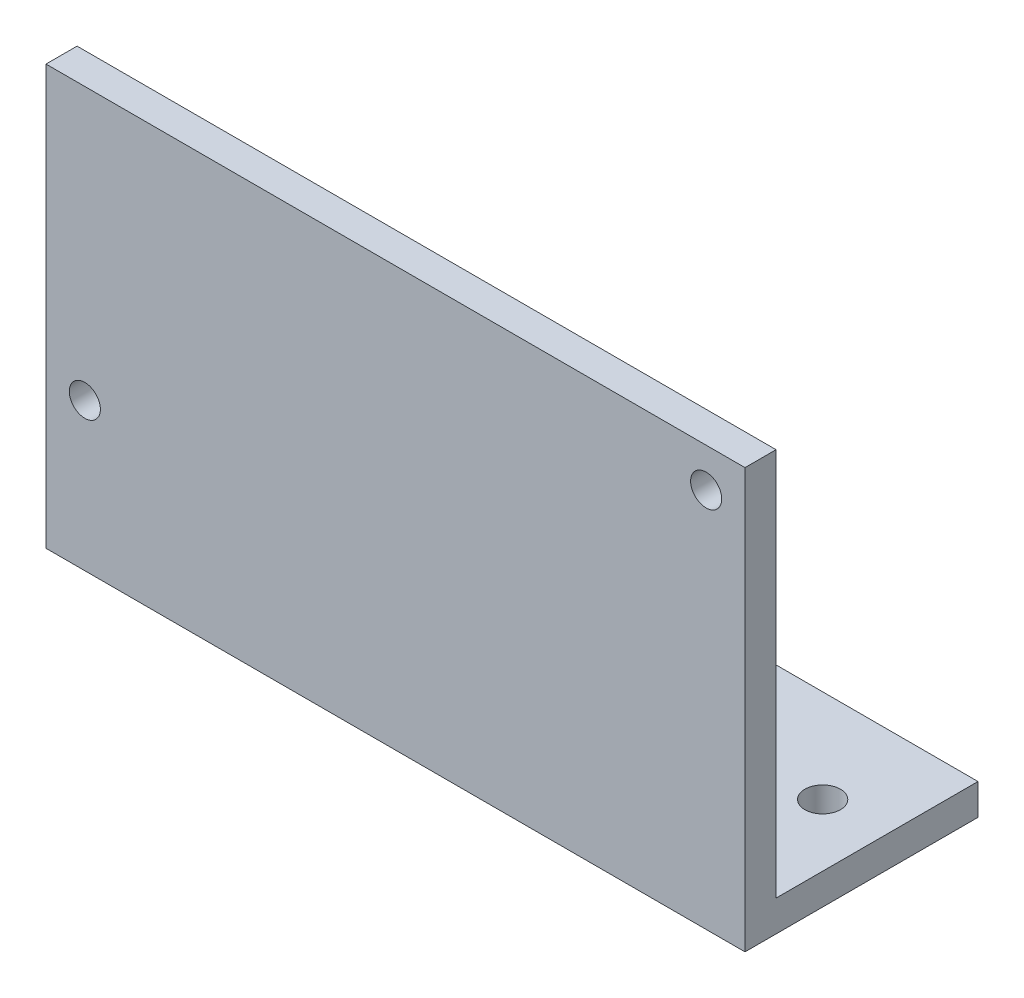
ISO-10303-21;
HEADER;
FILE_DESCRIPTION(('STEP AP214'),'2;1');
FILE_NAME('part.step','',(''),(''),'','','');
FILE_SCHEMA(('AUTOMOTIVE_DESIGN { 1 0 10303 214 1 1 1 1 }'));
ENDSEC;
DATA;
#1=APPLICATION_CONTEXT('core data for automotive mechanical design processes');
#2=APPLICATION_PROTOCOL_DEFINITION('international standard','automotive_design',2000,#1);
#3=PRODUCT_CONTEXT('',#1,'mechanical');
#4=PRODUCT('Part','Part','',(#3));
#5=PRODUCT_RELATED_PRODUCT_CATEGORY('part','',(#4));
#6=PRODUCT_DEFINITION_FORMATION('','',#4);
#7=PRODUCT_DEFINITION_CONTEXT('part definition',#1,'design');
#8=PRODUCT_DEFINITION('design','',#6,#7);
#9=PRODUCT_DEFINITION_SHAPE('','',#8);
#10=(LENGTH_UNIT() NAMED_UNIT(*) SI_UNIT(.MILLI.,.METRE.));
#11=(NAMED_UNIT(*) PLANE_ANGLE_UNIT() SI_UNIT($,.RADIAN.));
#12=(NAMED_UNIT(*) SI_UNIT($,.STERADIAN.) SOLID_ANGLE_UNIT());
#13=UNCERTAINTY_MEASURE_WITH_UNIT(LENGTH_MEASURE(1.E-05),#10,'distance_accuracy_value','');
#14=(GEOMETRIC_REPRESENTATION_CONTEXT(3) GLOBAL_UNCERTAINTY_ASSIGNED_CONTEXT((#13)) GLOBAL_UNIT_ASSIGNED_CONTEXT((#10,
#11,#12)) REPRESENTATION_CONTEXT('',''));
#15=CARTESIAN_POINT('',(0.,0.,0.));
#16=DIRECTION('',(0.,0.,1.));
#17=DIRECTION('',(1.,0.,0.));
#18=AXIS2_PLACEMENT_3D('',#15,#16,#17);
#19=CARTESIAN_POINT('',(16.8724801217886,-1.26370636243738,1.14413041174016));
#20=DIRECTION('',(1.,0.,0.));
#21=DIRECTION('',(0.,0.,-1.));
#22=AXIS2_PLACEMENT_3D('',#19,#20,#21);
#23=PLANE('',#22);
#24=DIRECTION('',(0.,-1.,0.));
#25=VECTOR('',#24,1.);
#26=CARTESIAN_POINT('',(16.8724801217886,-1.26370636243738,1.14413041174016));
#27=LINE('',#26,#25);
#28=CARTESIAN_POINT('',(16.8724801217886,8.11129363756262,1.14413041174016));
#29=VERTEX_POINT('',#28);
#30=CARTESIAN_POINT('',(16.8724801217886,-12.1387063624374,1.14413041174016));
#31=VERTEX_POINT('',#30);
#32=EDGE_CURVE('E55',#29,#31,#27,.T.);
#33=ORIENTED_EDGE('',*,*,#32,.T.);
#34=DIRECTION('',(0.,0.,-1.));
#35=VECTOR('',#34,1.);
#36=CARTESIAN_POINT('',(16.8724801217886,-12.1387063624374,1.14413041174016));
#37=LINE('',#36,#35);
#38=CARTESIAN_POINT('',(16.8724801217886,-12.1387063624374,-10.1058695882598));
#39=VERTEX_POINT('',#38);
#40=EDGE_CURVE('E110',#31,#39,#37,.T.);
#41=ORIENTED_EDGE('',*,*,#40,.T.);
#42=DIRECTION('',(0.,1.,0.));
#43=VECTOR('',#42,1.);
#44=CARTESIAN_POINT('',(16.8724801217886,-12.1387063624374,-10.1058695882598));
#45=LINE('',#44,#43);
#46=CARTESIAN_POINT('',(16.8724801217886,-10.6387063624374,-10.1058695882598));
#47=VERTEX_POINT('',#46);
#48=EDGE_CURVE('E136',#39,#47,#45,.T.);
#49=ORIENTED_EDGE('',*,*,#48,.T.);
#50=DIRECTION('',(0.,0.,1.));
#51=VECTOR('',#50,1.);
#52=CARTESIAN_POINT('',(16.8724801217886,-10.6387063624374,-10.1058695882598));
#53=LINE('',#52,#51);
#54=CARTESIAN_POINT('',(16.8724801217886,-10.6387063624374,-0.355869588259836));
#55=VERTEX_POINT('',#54);
#56=EDGE_CURVE('E114',#47,#55,#53,.T.);
#57=ORIENTED_EDGE('',*,*,#56,.T.);
#58=DIRECTION('',(0.,-1.,0.));
#59=VECTOR('',#58,1.);
#60=CARTESIAN_POINT('',(16.8724801217886,-1.26370636243738,-0.355869588259836));
#61=LINE('',#60,#59);
#62=CARTESIAN_POINT('',(16.8724801217886,8.11129363756262,-0.355869588259836));
#63=VERTEX_POINT('',#62);
#64=EDGE_CURVE('E111',#63,#55,#61,.T.);
#65=ORIENTED_EDGE('',*,*,#64,.F.);
#66=DIRECTION('',(0.,0.,-1.));
#67=VECTOR('',#66,1.);
#68=CARTESIAN_POINT('',(16.8724801217886,8.11129363756262,1.14413041174016));
#69=LINE('',#68,#67);
#70=EDGE_CURVE('E47',#29,#63,#69,.T.);
#71=ORIENTED_EDGE('',*,*,#70,.F.);
#72=EDGE_LOOP('',(#33,#41,#49,#57,#65,#71));
#73=FACE_BOUND('',#72,.T.);
#74=ADVANCED_FACE('F39',(#73),#23,.T.);
#75=CARTESIAN_POINT('',(-0.00251987821140183,8.11129363756262,1.14413041174016));
#76=DIRECTION('',(0.,1.,0.));
#77=DIRECTION('',(-1.,0.,0.));
#78=AXIS2_PLACEMENT_3D('',#75,#76,#77);
#79=PLANE('',#78);
#80=DIRECTION('',(1.,0.,0.));
#81=VECTOR('',#80,1.);
#82=CARTESIAN_POINT('',(-0.00251987821140183,8.11129363756262,-0.355869588259836));
#83=LINE('',#82,#81);
#84=CARTESIAN_POINT('',(-16.8775198782114,8.11129363756261,-0.355869588259836));
#85=VERTEX_POINT('',#84);
#86=EDGE_CURVE('E88',#85,#63,#83,.T.);
#87=ORIENTED_EDGE('',*,*,#86,.F.);
#88=DIRECTION('',(0.,0.,-1.));
#89=VECTOR('',#88,1.);
#90=CARTESIAN_POINT('',(-16.8775198782114,8.11129363756261,1.14413041174016));
#91=LINE('',#90,#89);
#92=CARTESIAN_POINT('',(-16.8775198782114,8.11129363756261,1.14413041174016));
#93=VERTEX_POINT('',#92);
#94=EDGE_CURVE('E82',#93,#85,#91,.T.);
#95=ORIENTED_EDGE('',*,*,#94,.F.);
#96=DIRECTION('',(1.,0.,0.));
#97=VECTOR('',#96,1.);
#98=CARTESIAN_POINT('',(-0.00251987821140183,8.11129363756262,1.14413041174016));
#99=LINE('',#98,#97);
#100=EDGE_CURVE('E86',#93,#29,#99,.T.);
#101=ORIENTED_EDGE('',*,*,#100,.T.);
#102=ORIENTED_EDGE('',*,*,#70,.T.);
#103=EDGE_LOOP('',(#87,#95,#101,#102));
#104=FACE_BOUND('',#103,.T.);
#105=ADVANCED_FACE('F84',(#104),#79,.T.);
#106=CARTESIAN_POINT('',(-16.8775198782114,-1.26370636243738,1.14413041174016));
#107=DIRECTION('',(1.,0.,0.));
#108=DIRECTION('',(0.,1.,0.));
#109=AXIS2_PLACEMENT_3D('',#106,#107,#108);
#110=PLANE('',#109);
#111=DIRECTION('',(0.,-1.,0.));
#112=VECTOR('',#111,1.);
#113=CARTESIAN_POINT('',(-16.8775198782114,-1.26370636243738,-0.355869588259836));
#114=LINE('',#113,#112);
#115=CARTESIAN_POINT('',(-16.8775198782114,-10.6387063624374,-0.355869588259836));
#116=VERTEX_POINT('',#115);
#117=EDGE_CURVE('E105',#85,#116,#114,.T.);
#118=ORIENTED_EDGE('',*,*,#117,.T.);
#119=DIRECTION('',(0.,0.,1.));
#120=VECTOR('',#119,1.);
#121=CARTESIAN_POINT('',(-16.8775198782114,-10.6387063624374,-10.1058695882598));
#122=LINE('',#121,#120);
#123=CARTESIAN_POINT('',(-16.8775198782114,-10.6387063624374,-10.1058695882598));
#124=VERTEX_POINT('',#123);
#125=EDGE_CURVE('E139',#124,#116,#122,.T.);
#126=ORIENTED_EDGE('',*,*,#125,.F.);
#127=DIRECTION('',(0.,-1.,0.));
#128=VECTOR('',#127,1.);
#129=CARTESIAN_POINT('',(-16.8775198782114,-10.6387063624374,-10.1058695882598));
#130=LINE('',#129,#128);
#131=CARTESIAN_POINT('',(-16.8775198782114,-12.1387063624374,-10.1058695882598));
#132=VERTEX_POINT('',#131);
#133=EDGE_CURVE('E133',#124,#132,#130,.T.);
#134=ORIENTED_EDGE('',*,*,#133,.T.);
#135=DIRECTION('',(0.,0.,-1.));
#136=VECTOR('',#135,1.);
#137=CARTESIAN_POINT('',(-16.8775198782114,-12.1387063624374,1.14413041174016));
#138=LINE('',#137,#136);
#139=CARTESIAN_POINT('',(-16.8775198782114,-12.1387063624374,1.14413041174016));
#140=VERTEX_POINT('',#139);
#141=EDGE_CURVE('E92',#140,#132,#138,.T.);
#142=ORIENTED_EDGE('',*,*,#141,.F.);
#143=DIRECTION('',(0.,-1.,0.));
#144=VECTOR('',#143,1.);
#145=CARTESIAN_POINT('',(-16.8775198782114,-1.26370636243738,1.14413041174016));
#146=LINE('',#145,#144);
#147=EDGE_CURVE('E95',#93,#140,#146,.T.);
#148=ORIENTED_EDGE('',*,*,#147,.F.);
#149=ORIENTED_EDGE('',*,*,#94,.T.);
#150=EDGE_LOOP('',(#118,#126,#134,#142,#148,#149));
#151=FACE_BOUND('',#150,.T.);
#152=ADVANCED_FACE('F96',(#151),#110,.F.);
#153=CARTESIAN_POINT('',(-0.00251987821139894,-12.1387063624374,1.14413041174016));
#154=DIRECTION('',(0.,1.,0.));
#155=DIRECTION('',(0.,0.,1.));
#156=AXIS2_PLACEMENT_3D('',#153,#154,#155);
#157=PLANE('',#156);
#158=CARTESIAN_POINT('',(-13.8775198782114,-12.1387063624374,-5.60586958825983));
#159=DIRECTION('',(0.,1.,0.));
#160=DIRECTION('',(0.,0.,1.));
#161=AXIS2_PLACEMENT_3D('',#158,#159,#160);
#162=CIRCLE('',#161,0.750000000000001);
#163=CARTESIAN_POINT('',(-13.8775198782114,-12.1387063624374,-4.85586958825983));
#164=VERTEX_POINT('',#163);
#165=EDGE_CURVE('E198',#164,#164,#162,.T.);
#166=ORIENTED_EDGE('',*,*,#165,.T.);
#167=EDGE_LOOP('',(#166));
#168=FACE_BOUND('',#167,.T.);
#169=CARTESIAN_POINT('',(13.8724801217886,-12.1387063624374,-5.60586958825983));
#170=DIRECTION('',(0.,1.,0.));
#171=DIRECTION('',(0.,0.,1.));
#172=AXIS2_PLACEMENT_3D('',#169,#170,#171);
#173=CIRCLE('',#172,0.858355693551781);
#174=CARTESIAN_POINT('',(13.8724801217886,-12.1387063624374,-4.74751389470805));
#175=VERTEX_POINT('',#174);
#176=EDGE_CURVE('E200',#175,#175,#173,.T.);
#177=ORIENTED_EDGE('',*,*,#176,.T.);
#178=EDGE_LOOP('',(#177));
#179=FACE_BOUND('',#178,.T.);
#180=ORIENTED_EDGE('',*,*,#141,.T.);
#181=DIRECTION('',(1.,0.,0.));
#182=VECTOR('',#181,1.);
#183=CARTESIAN_POINT('',(-16.8775198782114,-12.1387063624374,-10.1058695882598));
#184=LINE('',#183,#182);
#185=EDGE_CURVE('E125',#132,#39,#184,.T.);
#186=ORIENTED_EDGE('',*,*,#185,.T.);
#187=ORIENTED_EDGE('',*,*,#40,.F.);
#188=DIRECTION('',(1.,0.,0.));
#189=VECTOR('',#188,1.);
#190=CARTESIAN_POINT('',(-0.00251987821139894,-12.1387063624374,1.14413041174016));
#191=LINE('',#190,#189);
#192=EDGE_CURVE('E101',#140,#31,#191,.T.);
#193=ORIENTED_EDGE('',*,*,#192,.F.);
#194=EDGE_LOOP('',(#180,#186,#187,#193));
#195=FACE_BOUND('',#194,.T.);
#196=ADVANCED_FACE('F122',(#168,#179,#195),#157,.F.);
#197=CARTESIAN_POINT('',(-0.00251987821139894,-1.26370636243738,1.14413041174016));
#198=DIRECTION('',(0.,0.,1.));
#199=DIRECTION('',(1.,0.,0.));
#200=AXIS2_PLACEMENT_3D('',#197,#198,#199);
#201=PLANE('',#200);
#202=CARTESIAN_POINT('',(14.9974801217886,6.23629363756261,1.14413041174017));
#203=DIRECTION('',(0.,0.,1.));
#204=DIRECTION('',(1.,0.,0.));
#205=AXIS2_PLACEMENT_3D('',#202,#203,#204);
#206=CIRCLE('',#205,0.750000000000001);
#207=CARTESIAN_POINT('',(15.7474801217886,6.23629363756261,1.14413041174017));
#208=VERTEX_POINT('',#207);
#209=EDGE_CURVE('E142',#208,#208,#206,.T.);
#210=ORIENTED_EDGE('',*,*,#209,.F.);
#211=EDGE_LOOP('',(#210));
#212=FACE_BOUND('',#211,.T.);
#213=CARTESIAN_POINT('',(-15.0025198782114,-5.01370636243739,1.14413041174017));
#214=DIRECTION('',(0.,0.,1.));
#215=DIRECTION('',(1.,0.,0.));
#216=AXIS2_PLACEMENT_3D('',#213,#214,#215);
#217=CIRCLE('',#216,0.750000000000001);
#218=CARTESIAN_POINT('',(-14.2525198782114,-5.01370636243739,1.14413041174017));
#219=VERTEX_POINT('',#218);
#220=EDGE_CURVE('E210',#219,#219,#217,.T.);
#221=ORIENTED_EDGE('',*,*,#220,.F.);
#222=EDGE_LOOP('',(#221));
#223=FACE_BOUND('',#222,.T.);
#224=ORIENTED_EDGE('',*,*,#147,.T.);
#225=ORIENTED_EDGE('',*,*,#192,.T.);
#226=ORIENTED_EDGE('',*,*,#32,.F.);
#227=ORIENTED_EDGE('',*,*,#100,.F.);
#228=EDGE_LOOP('',(#224,#225,#226,#227));
#229=FACE_BOUND('',#228,.T.);
#230=ADVANCED_FACE('F103',(#212,#223,#229),#201,.T.);
#231=CARTESIAN_POINT('',(-0.00251987821139894,-1.26370636243738,-0.355869588259836));
#232=DIRECTION('',(0.,0.,1.));
#233=DIRECTION('',(1.,0.,0.));
#234=AXIS2_PLACEMENT_3D('',#231,#232,#233);
#235=PLANE('',#234);
#236=CARTESIAN_POINT('',(14.9974801217886,6.23629363756261,-0.355869588259836));
#237=DIRECTION('',(0.,0.,-1.));
#238=DIRECTION('',(-1.,0.,0.));
#239=AXIS2_PLACEMENT_3D('',#236,#237,#238);
#240=CIRCLE('',#239,0.750000000000001);
#241=CARTESIAN_POINT('',(14.2474801217886,6.23629363756261,-0.355869588259836));
#242=VERTEX_POINT('',#241);
#243=EDGE_CURVE('E203',#242,#242,#240,.T.);
#244=ORIENTED_EDGE('',*,*,#243,.F.);
#245=EDGE_LOOP('',(#244));
#246=FACE_BOUND('',#245,.T.);
#247=CARTESIAN_POINT('',(-15.0025198782114,-5.01370636243739,-0.355869588259836));
#248=DIRECTION('',(0.,0.,-1.));
#249=DIRECTION('',(-1.,0.,0.));
#250=AXIS2_PLACEMENT_3D('',#247,#248,#249);
#251=CIRCLE('',#250,0.750000000000001);
#252=CARTESIAN_POINT('',(-15.7525198782114,-5.01370636243739,-0.355869588259836));
#253=VERTEX_POINT('',#252);
#254=EDGE_CURVE('E199',#253,#253,#251,.T.);
#255=ORIENTED_EDGE('',*,*,#254,.F.);
#256=EDGE_LOOP('',(#255));
#257=FACE_BOUND('',#256,.T.);
#258=ORIENTED_EDGE('',*,*,#64,.T.);
#259=DIRECTION('',(-1.,0.,0.));
#260=VECTOR('',#259,1.);
#261=CARTESIAN_POINT('',(-0.00251987821139641,-10.6387063624374,-0.355869588259836));
#262=LINE('',#261,#260);
#263=EDGE_CURVE('E11',#55,#116,#262,.T.);
#264=ORIENTED_EDGE('',*,*,#263,.T.);
#265=ORIENTED_EDGE('',*,*,#117,.F.);
#266=ORIENTED_EDGE('',*,*,#86,.T.);
#267=EDGE_LOOP('',(#258,#264,#265,#266));
#268=FACE_BOUND('',#267,.T.);
#269=ADVANCED_FACE('F149',(#246,#257,#268),#235,.F.);
#270=CARTESIAN_POINT('',(16.8724801217886,-10.6387063624374,-10.1058695882598));
#271=DIRECTION('',(0.,1.,0.));
#272=DIRECTION('',(-1.,0.,0.));
#273=AXIS2_PLACEMENT_3D('',#270,#271,#272);
#274=PLANE('',#273);
#275=CARTESIAN_POINT('',(-13.8775198782114,-10.6387063624374,-5.60586958825983));
#276=DIRECTION('',(0.,1.,0.));
#277=DIRECTION('',(-1.,0.,0.));
#278=AXIS2_PLACEMENT_3D('',#275,#276,#277);
#279=CIRCLE('',#278,0.750000000000001);
#280=CARTESIAN_POINT('',(-14.6275198782114,-10.6387063624374,-5.60586958825983));
#281=VERTEX_POINT('',#280);
#282=EDGE_CURVE('E195',#281,#281,#279,.T.);
#283=ORIENTED_EDGE('',*,*,#282,.F.);
#284=EDGE_LOOP('',(#283));
#285=FACE_BOUND('',#284,.T.);
#286=CARTESIAN_POINT('',(13.8724801217886,-10.6387063624374,-5.60586958825983));
#287=DIRECTION('',(0.,1.,0.));
#288=DIRECTION('',(-1.,0.,0.));
#289=AXIS2_PLACEMENT_3D('',#286,#287,#288);
#290=CIRCLE('',#289,0.858355693551781);
#291=CARTESIAN_POINT('',(13.0141244282368,-10.6387063624374,-5.60586958825983));
#292=VERTEX_POINT('',#291);
#293=EDGE_CURVE('E222',#292,#292,#290,.T.);
#294=ORIENTED_EDGE('',*,*,#293,.F.);
#295=EDGE_LOOP('',(#294));
#296=FACE_BOUND('',#295,.T.);
#297=ORIENTED_EDGE('',*,*,#263,.F.);
#298=ORIENTED_EDGE('',*,*,#56,.F.);
#299=DIRECTION('',(-1.,0.,0.));
#300=VECTOR('',#299,1.);
#301=CARTESIAN_POINT('',(16.8724801217886,-10.6387063624374,-10.1058695882598));
#302=LINE('',#301,#300);
#303=EDGE_CURVE('E140',#47,#124,#302,.T.);
#304=ORIENTED_EDGE('',*,*,#303,.T.);
#305=ORIENTED_EDGE('',*,*,#125,.T.);
#306=EDGE_LOOP('',(#297,#298,#304,#305));
#307=FACE_BOUND('',#306,.T.);
#308=ADVANCED_FACE('F147',(#285,#296,#307),#274,.T.);
#309=CARTESIAN_POINT('',(-0.00251987821139894,-1.26370636243738,-10.1058695882598));
#310=DIRECTION('',(0.,0.,1.));
#311=DIRECTION('',(1.,0.,0.));
#312=AXIS2_PLACEMENT_3D('',#309,#310,#311);
#313=PLANE('',#312);
#314=ORIENTED_EDGE('',*,*,#303,.F.);
#315=ORIENTED_EDGE('',*,*,#48,.F.);
#316=ORIENTED_EDGE('',*,*,#185,.F.);
#317=ORIENTED_EDGE('',*,*,#133,.F.);
#318=EDGE_LOOP('',(#314,#315,#316,#317));
#319=FACE_BOUND('',#318,.T.);
#320=ADVANCED_FACE('F132',(#319),#313,.F.);
#321=CARTESIAN_POINT('',(-15.0025198782114,-5.01370636243739,13.1441304117402));
#322=DIRECTION('',(0.,0.,-1.));
#323=DIRECTION('',(-1.,0.,0.));
#324=AXIS2_PLACEMENT_3D('',#321,#322,#323);
#325=CYLINDRICAL_SURFACE('',#324,0.750000000000001);
#326=ORIENTED_EDGE('',*,*,#220,.T.);
#327=EDGE_LOOP('',(#326));
#328=FACE_BOUND('',#327,.T.);
#329=ORIENTED_EDGE('',*,*,#254,.T.);
#330=EDGE_LOOP('',(#329));
#331=FACE_BOUND('',#330,.T.);
#332=ADVANCED_FACE('F175',(#328,#331),#325,.F.);
#333=CARTESIAN_POINT('',(14.9974801217886,6.23629363756261,13.1441304117402));
#334=DIRECTION('',(0.,0.,-1.));
#335=DIRECTION('',(-1.,0.,0.));
#336=AXIS2_PLACEMENT_3D('',#333,#334,#335);
#337=CYLINDRICAL_SURFACE('',#336,0.750000000000001);
#338=ORIENTED_EDGE('',*,*,#209,.T.);
#339=EDGE_LOOP('',(#338));
#340=FACE_BOUND('',#339,.T.);
#341=ORIENTED_EDGE('',*,*,#243,.T.);
#342=EDGE_LOOP('',(#341));
#343=FACE_BOUND('',#342,.T.);
#344=ADVANCED_FACE('F178',(#340,#343),#337,.F.);
#345=CARTESIAN_POINT('',(13.8724801217886,-24.1387063624374,-5.60586958825983));
#346=DIRECTION('',(0.,1.,0.));
#347=DIRECTION('',(-1.,0.,0.));
#348=AXIS2_PLACEMENT_3D('',#345,#346,#347);
#349=CYLINDRICAL_SURFACE('',#348,0.858355693551781);
#350=ORIENTED_EDGE('',*,*,#293,.T.);
#351=EDGE_LOOP('',(#350));
#352=FACE_BOUND('',#351,.T.);
#353=ORIENTED_EDGE('',*,*,#176,.F.);
#354=EDGE_LOOP('',(#353));
#355=FACE_BOUND('',#354,.T.);
#356=ADVANCED_FACE('F182',(#352,#355),#349,.F.);
#357=CARTESIAN_POINT('',(-13.8775198782114,-24.1387063624374,-5.60586958825983));
#358=DIRECTION('',(0.,1.,0.));
#359=DIRECTION('',(-1.,0.,0.));
#360=AXIS2_PLACEMENT_3D('',#357,#358,#359);
#361=CYLINDRICAL_SURFACE('',#360,0.750000000000001);
#362=ORIENTED_EDGE('',*,*,#282,.T.);
#363=EDGE_LOOP('',(#362));
#364=FACE_BOUND('',#363,.T.);
#365=ORIENTED_EDGE('',*,*,#165,.F.);
#366=EDGE_LOOP('',(#365));
#367=FACE_BOUND('',#366,.T.);
#368=ADVANCED_FACE('F186',(#364,#367),#361,.F.);
#369=CLOSED_SHELL('',(#74,#105,#152,#196,#230,#269,#308,#320,#332,#344,#356,#368));
#370=MANIFOLD_SOLID_BREP('B2',#369);
#371=ADVANCED_BREP_SHAPE_REPRESENTATION('',(#18,#370),#14);
#372=SHAPE_DEFINITION_REPRESENTATION(#9,#371);
ENDSEC;
END-ISO-10303-21;
